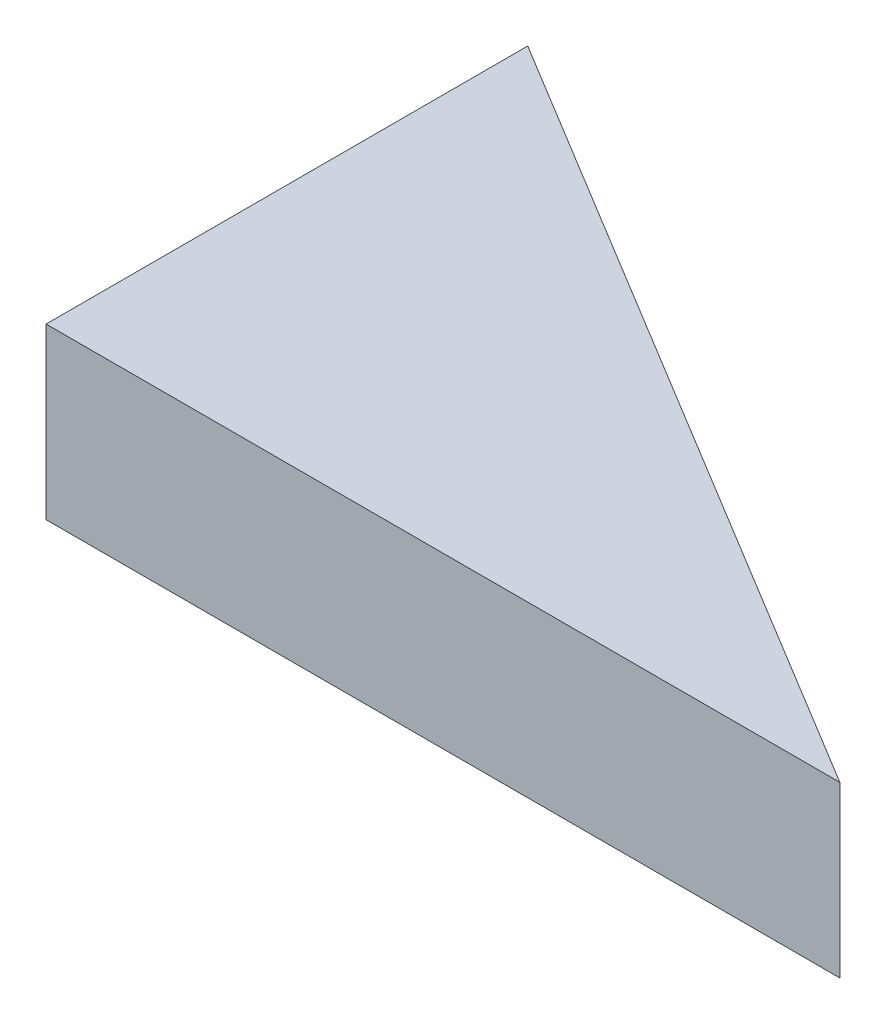
ISO-10303-21;
HEADER;
FILE_DESCRIPTION(('STEP AP214'),'2;1');
FILE_NAME('part.step','',(''),(''),'','','');
FILE_SCHEMA(('AUTOMOTIVE_DESIGN { 1 0 10303 214 1 1 1 1 }'));
ENDSEC;
DATA;
#1=APPLICATION_CONTEXT('core data for automotive mechanical design processes');
#2=APPLICATION_PROTOCOL_DEFINITION('international standard','automotive_design',2000,#1);
#3=PRODUCT_CONTEXT('',#1,'mechanical');
#4=PRODUCT('Part','Part','',(#3));
#5=PRODUCT_RELATED_PRODUCT_CATEGORY('part','',(#4));
#6=PRODUCT_DEFINITION_FORMATION('','',#4);
#7=PRODUCT_DEFINITION_CONTEXT('part definition',#1,'design');
#8=PRODUCT_DEFINITION('design','',#6,#7);
#9=PRODUCT_DEFINITION_SHAPE('','',#8);
#10=(LENGTH_UNIT() NAMED_UNIT(*) SI_UNIT(.MILLI.,.METRE.));
#11=(NAMED_UNIT(*) PLANE_ANGLE_UNIT() SI_UNIT($,.RADIAN.));
#12=(NAMED_UNIT(*) SI_UNIT($,.STERADIAN.) SOLID_ANGLE_UNIT());
#13=UNCERTAINTY_MEASURE_WITH_UNIT(LENGTH_MEASURE(1.E-05),#10,'distance_accuracy_value','');
#14=(GEOMETRIC_REPRESENTATION_CONTEXT(3) GLOBAL_UNCERTAINTY_ASSIGNED_CONTEXT((#13)) GLOBAL_UNIT_ASSIGNED_CONTEXT((#10,
#11,#12)) REPRESENTATION_CONTEXT('',''));
#15=CARTESIAN_POINT('',(0.,0.,0.));
#16=DIRECTION('',(0.,0.,1.));
#17=DIRECTION('',(1.,0.,0.));
#18=AXIS2_PLACEMENT_3D('',#15,#16,#17);
#19=CARTESIAN_POINT('',(226.06,48.26,0.));
#20=DIRECTION('',(0.,0.,-1.));
#21=DIRECTION('',(-1.,0.,0.));
#22=AXIS2_PLACEMENT_3D('',#19,#20,#21);
#23=PLANE('',#22);
#24=DIRECTION('',(1.,0.,0.));
#25=VECTOR('',#24,1.);
#26=CARTESIAN_POINT('',(226.06,0.,0.));
#27=LINE('',#26,#25);
#28=CARTESIAN_POINT('',(0.,0.,0.));
#29=VERTEX_POINT('',#28);
#30=CARTESIAN_POINT('',(226.06,0.,0.));
#31=VERTEX_POINT('',#30);
#32=EDGE_CURVE('E81',#29,#31,#27,.T.);
#33=ORIENTED_EDGE('',*,*,#32,.T.);
#34=DIRECTION('',(0.,-1.,0.));
#35=VECTOR('',#34,1.);
#36=CARTESIAN_POINT('',(226.06,48.26,0.));
#37=LINE('',#36,#35);
#38=CARTESIAN_POINT('',(226.06,48.26,0.));
#39=VERTEX_POINT('',#38);
#40=EDGE_CURVE('E11',#39,#31,#37,.T.);
#41=ORIENTED_EDGE('',*,*,#40,.F.);
#42=DIRECTION('',(1.,0.,0.));
#43=VECTOR('',#42,1.);
#44=CARTESIAN_POINT('',(226.06,48.26,0.));
#45=LINE('',#44,#43);
#46=CARTESIAN_POINT('',(0.,48.26,0.));
#47=VERTEX_POINT('',#46);
#48=EDGE_CURVE('E74',#47,#39,#45,.T.);
#49=ORIENTED_EDGE('',*,*,#48,.F.);
#50=DIRECTION('',(0.,-1.,0.));
#51=VECTOR('',#50,1.);
#52=CARTESIAN_POINT('',(0.,48.26,0.));
#53=LINE('',#52,#51);
#54=EDGE_CURVE('E82',#47,#29,#53,.T.);
#55=ORIENTED_EDGE('',*,*,#54,.T.);
#56=EDGE_LOOP('',(#33,#41,#49,#55));
#57=FACE_BOUND('',#56,.T.);
#58=ADVANCED_FACE('F34',(#57),#23,.F.);
#59=CARTESIAN_POINT('',(0.,48.26,-137.16));
#60=DIRECTION('',(-0.518727441111277,0.,0.854939671461178));
#61=DIRECTION('',(0.854939671461178,0.,0.518727441111277));
#62=AXIS2_PLACEMENT_3D('',#59,#60,#61);
#63=PLANE('',#62);
#64=DIRECTION('',(-0.854939671461178,0.,-0.518727441111277));
#65=VECTOR('',#64,1.);
#66=CARTESIAN_POINT('',(0.,0.,-137.16));
#67=LINE('',#66,#65);
#68=CARTESIAN_POINT('',(0.,0.,-137.16));
#69=VERTEX_POINT('',#68);
#70=EDGE_CURVE('E62',#31,#69,#67,.T.);
#71=ORIENTED_EDGE('',*,*,#70,.T.);
#72=DIRECTION('',(0.,-1.,0.));
#73=VECTOR('',#72,1.);
#74=CARTESIAN_POINT('',(0.,48.26,-137.16));
#75=LINE('',#74,#73);
#76=CARTESIAN_POINT('',(0.,48.26,-137.16));
#77=VERTEX_POINT('',#76);
#78=EDGE_CURVE('E42',#77,#69,#75,.T.);
#79=ORIENTED_EDGE('',*,*,#78,.F.);
#80=DIRECTION('',(-0.854939671461178,0.,-0.518727441111277));
#81=VECTOR('',#80,1.);
#82=CARTESIAN_POINT('',(0.,48.26,-137.16));
#83=LINE('',#82,#81);
#84=EDGE_CURVE('E70',#39,#77,#83,.T.);
#85=ORIENTED_EDGE('',*,*,#84,.F.);
#86=ORIENTED_EDGE('',*,*,#40,.T.);
#87=EDGE_LOOP('',(#71,#79,#85,#86));
#88=FACE_BOUND('',#87,.T.);
#89=ADVANCED_FACE('F71',(#88),#63,.F.);
#90=CARTESIAN_POINT('',(0.,48.26,0.));
#91=DIRECTION('',(1.,0.,0.));
#92=DIRECTION('',(0.,0.,-1.));
#93=AXIS2_PLACEMENT_3D('',#90,#91,#92);
#94=PLANE('',#93);
#95=DIRECTION('',(0.,0.,1.));
#96=VECTOR('',#95,1.);
#97=CARTESIAN_POINT('',(0.,0.,0.));
#98=LINE('',#97,#96);
#99=EDGE_CURVE('E67',#69,#29,#98,.T.);
#100=ORIENTED_EDGE('',*,*,#99,.T.);
#101=ORIENTED_EDGE('',*,*,#54,.F.);
#102=DIRECTION('',(0.,0.,1.));
#103=VECTOR('',#102,1.);
#104=CARTESIAN_POINT('',(0.,48.26,0.));
#105=LINE('',#104,#103);
#106=EDGE_CURVE('E50',#77,#47,#105,.T.);
#107=ORIENTED_EDGE('',*,*,#106,.F.);
#108=ORIENTED_EDGE('',*,*,#78,.T.);
#109=EDGE_LOOP('',(#100,#101,#107,#108));
#110=FACE_BOUND('',#109,.T.);
#111=ADVANCED_FACE('F89',(#110),#94,.F.);
#112=CARTESIAN_POINT('',(0.,48.26,0.));
#113=DIRECTION('',(0.,-1.,0.));
#114=DIRECTION('',(0.,0.,-1.));
#115=AXIS2_PLACEMENT_3D('',#112,#113,#114);
#116=PLANE('',#115);
#117=ORIENTED_EDGE('',*,*,#48,.T.);
#118=ORIENTED_EDGE('',*,*,#84,.T.);
#119=ORIENTED_EDGE('',*,*,#106,.T.);
#120=EDGE_LOOP('',(#117,#118,#119));
#121=FACE_BOUND('',#120,.T.);
#122=ADVANCED_FACE('F77',(#121),#116,.F.);
#123=CARTESIAN_POINT('',(0.,0.,0.));
#124=DIRECTION('',(0.,-1.,0.));
#125=DIRECTION('',(0.,0.,-1.));
#126=AXIS2_PLACEMENT_3D('',#123,#124,#125);
#127=PLANE('',#126);
#128=ORIENTED_EDGE('',*,*,#32,.F.);
#129=ORIENTED_EDGE('',*,*,#99,.F.);
#130=ORIENTED_EDGE('',*,*,#70,.F.);
#131=EDGE_LOOP('',(#128,#129,#130));
#132=FACE_BOUND('',#131,.T.);
#133=ADVANCED_FACE('F90',(#132),#127,.T.);
#134=CLOSED_SHELL('',(#58,#89,#111,#122,#133));
#135=MANIFOLD_SOLID_BREP('B2',#134);
#136=ADVANCED_BREP_SHAPE_REPRESENTATION('',(#18,#135),#14);
#137=SHAPE_DEFINITION_REPRESENTATION(#9,#136);
ENDSEC;
END-ISO-10303-21;
